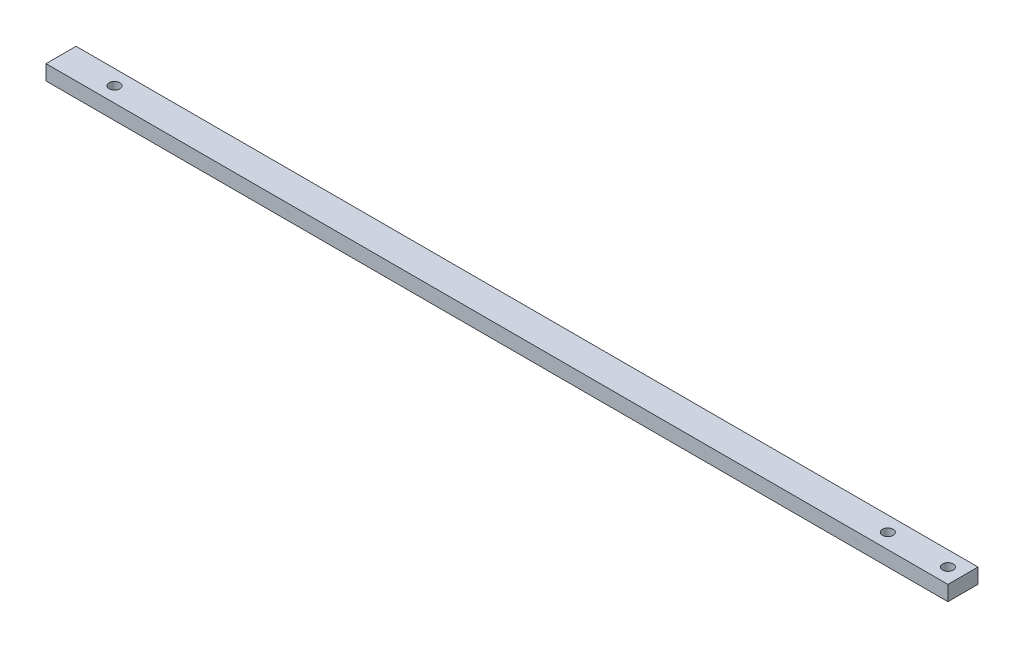
ISO-10303-21;
HEADER;
FILE_DESCRIPTION(('STEP AP214'),'2;1');
FILE_NAME('part.step','',(''),(''),'','','');
FILE_SCHEMA(('AUTOMOTIVE_DESIGN { 1 0 10303 214 1 1 1 1 }'));
ENDSEC;
DATA;
#1=APPLICATION_CONTEXT('core data for automotive mechanical design processes');
#2=APPLICATION_PROTOCOL_DEFINITION('international standard','automotive_design',2000,#1);
#3=PRODUCT_CONTEXT('',#1,'mechanical');
#4=PRODUCT('Part','Part','',(#3));
#5=PRODUCT_RELATED_PRODUCT_CATEGORY('part','',(#4));
#6=PRODUCT_DEFINITION_FORMATION('','',#4);
#7=PRODUCT_DEFINITION_CONTEXT('part definition',#1,'design');
#8=PRODUCT_DEFINITION('design','',#6,#7);
#9=PRODUCT_DEFINITION_SHAPE('','',#8);
#10=(LENGTH_UNIT() NAMED_UNIT(*) SI_UNIT(.MILLI.,.METRE.));
#11=(NAMED_UNIT(*) PLANE_ANGLE_UNIT() SI_UNIT($,.RADIAN.));
#12=(NAMED_UNIT(*) SI_UNIT($,.STERADIAN.) SOLID_ANGLE_UNIT());
#13=UNCERTAINTY_MEASURE_WITH_UNIT(LENGTH_MEASURE(1.E-05),#10,'distance_accuracy_value','');
#14=(GEOMETRIC_REPRESENTATION_CONTEXT(3) GLOBAL_UNCERTAINTY_ASSIGNED_CONTEXT((#13)) GLOBAL_UNIT_ASSIGNED_CONTEXT((#10,
#11,#12)) REPRESENTATION_CONTEXT('',''));
#15=CARTESIAN_POINT('',(0.,0.,0.));
#16=DIRECTION('',(0.,0.,1.));
#17=DIRECTION('',(1.,0.,0.));
#18=AXIS2_PLACEMENT_3D('',#15,#16,#17);
#19=CARTESIAN_POINT('',(0.,6.35,-12.7));
#20=DIRECTION('',(0.,0.,-1.));
#21=DIRECTION('',(-1.,0.,0.));
#22=AXIS2_PLACEMENT_3D('',#19,#20,#21);
#23=PLANE('',#22);
#24=DIRECTION('',(1.,0.,0.));
#25=VECTOR('',#24,1.);
#26=CARTESIAN_POINT('',(0.,0.,-12.7));
#27=LINE('',#26,#25);
#28=CARTESIAN_POINT('',(0.,0.,-12.7));
#29=VERTEX_POINT('',#28);
#30=CARTESIAN_POINT('',(381.,0.,-12.7));
#31=VERTEX_POINT('',#30);
#32=EDGE_CURVE('E114',#29,#31,#27,.T.);
#33=ORIENTED_EDGE('',*,*,#32,.F.);
#34=DIRECTION('',(0.,-1.,0.));
#35=VECTOR('',#34,1.);
#36=CARTESIAN_POINT('',(0.,6.35,-12.7));
#37=LINE('',#36,#35);
#38=CARTESIAN_POINT('',(0.,6.35,-12.7));
#39=VERTEX_POINT('',#38);
#40=EDGE_CURVE('E11',#39,#29,#37,.T.);
#41=ORIENTED_EDGE('',*,*,#40,.F.);
#42=DIRECTION('',(1.,0.,0.));
#43=VECTOR('',#42,1.);
#44=CARTESIAN_POINT('',(0.,6.35,-12.7));
#45=LINE('',#44,#43);
#46=CARTESIAN_POINT('',(381.,6.35,-12.7));
#47=VERTEX_POINT('',#46);
#48=EDGE_CURVE('E98',#39,#47,#45,.T.);
#49=ORIENTED_EDGE('',*,*,#48,.T.);
#50=DIRECTION('',(0.,-1.,0.));
#51=VECTOR('',#50,1.);
#52=CARTESIAN_POINT('',(381.,6.35,-12.7));
#53=LINE('',#52,#51);
#54=EDGE_CURVE('E77',#47,#31,#53,.T.);
#55=ORIENTED_EDGE('',*,*,#54,.T.);
#56=EDGE_LOOP('',(#33,#41,#49,#55));
#57=FACE_BOUND('',#56,.T.);
#58=ADVANCED_FACE('F37',(#57),#23,.T.);
#59=CARTESIAN_POINT('',(0.,6.35,0.));
#60=DIRECTION('',(-1.,0.,0.));
#61=DIRECTION('',(0.,0.,1.));
#62=AXIS2_PLACEMENT_3D('',#59,#60,#61);
#63=PLANE('',#62);
#64=DIRECTION('',(0.,0.,-1.));
#65=VECTOR('',#64,1.);
#66=CARTESIAN_POINT('',(0.,0.,0.));
#67=LINE('',#66,#65);
#68=CARTESIAN_POINT('',(0.,0.,0.));
#69=VERTEX_POINT('',#68);
#70=EDGE_CURVE('E89',#69,#29,#67,.T.);
#71=ORIENTED_EDGE('',*,*,#70,.F.);
#72=DIRECTION('',(0.,-1.,0.));
#73=VECTOR('',#72,1.);
#74=CARTESIAN_POINT('',(0.,6.35,0.));
#75=LINE('',#74,#73);
#76=CARTESIAN_POINT('',(0.,6.35,0.));
#77=VERTEX_POINT('',#76);
#78=EDGE_CURVE('E46',#77,#69,#75,.T.);
#79=ORIENTED_EDGE('',*,*,#78,.F.);
#80=DIRECTION('',(0.,0.,-1.));
#81=VECTOR('',#80,1.);
#82=CARTESIAN_POINT('',(0.,6.35,0.));
#83=LINE('',#82,#81);
#84=EDGE_CURVE('E87',#77,#39,#83,.T.);
#85=ORIENTED_EDGE('',*,*,#84,.T.);
#86=ORIENTED_EDGE('',*,*,#40,.T.);
#87=EDGE_LOOP('',(#71,#79,#85,#86));
#88=FACE_BOUND('',#87,.T.);
#89=ADVANCED_FACE('F85',(#88),#63,.T.);
#90=CARTESIAN_POINT('',(0.,6.35,0.));
#91=DIRECTION('',(0.,0.,-1.));
#92=DIRECTION('',(-1.,0.,0.));
#93=AXIS2_PLACEMENT_3D('',#90,#91,#92);
#94=PLANE('',#93);
#95=DIRECTION('',(1.,0.,0.));
#96=VECTOR('',#95,1.);
#97=CARTESIAN_POINT('',(0.,0.,0.));
#98=LINE('',#97,#96);
#99=CARTESIAN_POINT('',(381.,0.,0.));
#100=VERTEX_POINT('',#99);
#101=EDGE_CURVE('E117',#69,#100,#98,.T.);
#102=ORIENTED_EDGE('',*,*,#101,.T.);
#103=DIRECTION('',(0.,-1.,0.));
#104=VECTOR('',#103,1.);
#105=CARTESIAN_POINT('',(381.,6.35,0.));
#106=LINE('',#105,#104);
#107=CARTESIAN_POINT('',(381.,6.35,0.));
#108=VERTEX_POINT('',#107);
#109=EDGE_CURVE('E92',#108,#100,#106,.T.);
#110=ORIENTED_EDGE('',*,*,#109,.F.);
#111=DIRECTION('',(1.,0.,0.));
#112=VECTOR('',#111,1.);
#113=CARTESIAN_POINT('',(0.,6.35,0.));
#114=LINE('',#113,#112);
#115=EDGE_CURVE('E94',#77,#108,#114,.T.);
#116=ORIENTED_EDGE('',*,*,#115,.F.);
#117=ORIENTED_EDGE('',*,*,#78,.T.);
#118=EDGE_LOOP('',(#102,#110,#116,#117));
#119=FACE_BOUND('',#118,.T.);
#120=ADVANCED_FACE('F95',(#119),#94,.F.);
#121=CARTESIAN_POINT('',(349.25,6.35,-6.35));
#122=DIRECTION('',(0.,-1.,0.));
#123=DIRECTION('',(0.,0.,-1.));
#124=AXIS2_PLACEMENT_3D('',#121,#122,#123);
#125=CYLINDRICAL_SURFACE('',#124,2.24790000000001);
#126=CARTESIAN_POINT('',(349.25,6.35,-6.35));
#127=DIRECTION('',(0.,1.,0.));
#128=DIRECTION('',(0.,0.,1.));
#129=AXIS2_PLACEMENT_3D('',#126,#127,#128);
#130=CIRCLE('',#129,2.24790000000001);
#131=CARTESIAN_POINT('',(349.25,6.35,-4.10209999999999));
#132=VERTEX_POINT('',#131);
#133=EDGE_CURVE('E100',#132,#132,#130,.T.);
#134=ORIENTED_EDGE('',*,*,#133,.T.);
#135=EDGE_LOOP('',(#134));
#136=FACE_BOUND('',#135,.T.);
#137=CARTESIAN_POINT('',(349.25,0.,-6.35));
#138=DIRECTION('',(0.,1.,0.));
#139=DIRECTION('',(0.,0.,1.));
#140=AXIS2_PLACEMENT_3D('',#137,#138,#139);
#141=CIRCLE('',#140,2.24790000000001);
#142=CARTESIAN_POINT('',(349.25,0.,-4.10209999999999));
#143=VERTEX_POINT('',#142);
#144=EDGE_CURVE('E111',#143,#143,#141,.T.);
#145=ORIENTED_EDGE('',*,*,#144,.F.);
#146=EDGE_LOOP('',(#145));
#147=FACE_BOUND('',#146,.T.);
#148=ADVANCED_FACE('F133',(#136,#147),#125,.F.);
#149=CARTESIAN_POINT('',(374.65,6.35,-6.35));
#150=DIRECTION('',(0.,-1.,0.));
#151=DIRECTION('',(0.,0.,-1.));
#152=AXIS2_PLACEMENT_3D('',#149,#150,#151);
#153=CYLINDRICAL_SURFACE('',#152,2.24790000000001);
#154=CARTESIAN_POINT('',(374.65,6.35,-6.35));
#155=DIRECTION('',(0.,1.,0.));
#156=DIRECTION('',(0.,0.,1.));
#157=AXIS2_PLACEMENT_3D('',#154,#155,#156);
#158=CIRCLE('',#157,2.24790000000001);
#159=CARTESIAN_POINT('',(374.65,6.35,-4.10209999999999));
#160=VERTEX_POINT('',#159);
#161=EDGE_CURVE('E146',#160,#160,#158,.T.);
#162=ORIENTED_EDGE('',*,*,#161,.T.);
#163=EDGE_LOOP('',(#162));
#164=FACE_BOUND('',#163,.T.);
#165=CARTESIAN_POINT('',(374.65,0.,-6.35));
#166=DIRECTION('',(0.,1.,0.));
#167=DIRECTION('',(0.,0.,1.));
#168=AXIS2_PLACEMENT_3D('',#165,#166,#167);
#169=CIRCLE('',#168,2.24790000000001);
#170=CARTESIAN_POINT('',(374.65,0.,-4.10209999999999));
#171=VERTEX_POINT('',#170);
#172=EDGE_CURVE('E108',#171,#171,#169,.T.);
#173=ORIENTED_EDGE('',*,*,#172,.F.);
#174=EDGE_LOOP('',(#173));
#175=FACE_BOUND('',#174,.T.);
#176=ADVANCED_FACE('F135',(#164,#175),#153,.F.);
#177=CARTESIAN_POINT('',(22.5679,6.35,-6.35));
#178=DIRECTION('',(0.,-1.,0.));
#179=DIRECTION('',(0.,0.,-1.));
#180=AXIS2_PLACEMENT_3D('',#177,#178,#179);
#181=CYLINDRICAL_SURFACE('',#180,2.2479);
#182=CARTESIAN_POINT('',(22.5679,6.35,-6.35));
#183=DIRECTION('',(0.,1.,0.));
#184=DIRECTION('',(0.,0.,1.));
#185=AXIS2_PLACEMENT_3D('',#182,#183,#184);
#186=CIRCLE('',#185,2.2479);
#187=CARTESIAN_POINT('',(22.5679,6.35,-4.1021));
#188=VERTEX_POINT('',#187);
#189=EDGE_CURVE('E120',#188,#188,#186,.T.);
#190=ORIENTED_EDGE('',*,*,#189,.T.);
#191=EDGE_LOOP('',(#190));
#192=FACE_BOUND('',#191,.T.);
#193=CARTESIAN_POINT('',(22.5679,0.,-6.35));
#194=DIRECTION('',(0.,1.,0.));
#195=DIRECTION('',(0.,0.,1.));
#196=AXIS2_PLACEMENT_3D('',#193,#194,#195);
#197=CIRCLE('',#196,2.2479);
#198=CARTESIAN_POINT('',(22.5679,0.,-4.1021));
#199=VERTEX_POINT('',#198);
#200=EDGE_CURVE('E105',#199,#199,#197,.T.);
#201=ORIENTED_EDGE('',*,*,#200,.F.);
#202=EDGE_LOOP('',(#201));
#203=FACE_BOUND('',#202,.T.);
#204=ADVANCED_FACE('F39',(#192,#203),#181,.F.);
#205=CARTESIAN_POINT('',(381.,6.35,0.));
#206=DIRECTION('',(-1.,0.,0.));
#207=DIRECTION('',(0.,0.,1.));
#208=AXIS2_PLACEMENT_3D('',#205,#206,#207);
#209=PLANE('',#208);
#210=DIRECTION('',(0.,0.,-1.));
#211=VECTOR('',#210,1.);
#212=CARTESIAN_POINT('',(381.,0.,0.));
#213=LINE('',#212,#211);
#214=EDGE_CURVE('E70',#100,#31,#213,.T.);
#215=ORIENTED_EDGE('',*,*,#214,.T.);
#216=ORIENTED_EDGE('',*,*,#54,.F.);
#217=DIRECTION('',(0.,0.,-1.));
#218=VECTOR('',#217,1.);
#219=CARTESIAN_POINT('',(381.,6.35,0.));
#220=LINE('',#219,#218);
#221=EDGE_CURVE('E54',#108,#47,#220,.T.);
#222=ORIENTED_EDGE('',*,*,#221,.F.);
#223=ORIENTED_EDGE('',*,*,#109,.T.);
#224=EDGE_LOOP('',(#215,#216,#222,#223));
#225=FACE_BOUND('',#224,.T.);
#226=ADVANCED_FACE('F123',(#225),#209,.F.);
#227=CARTESIAN_POINT('',(0.,6.35,0.));
#228=DIRECTION('',(0.,1.,0.));
#229=DIRECTION('',(0.,0.,1.));
#230=AXIS2_PLACEMENT_3D('',#227,#228,#229);
#231=PLANE('',#230);
#232=ORIENTED_EDGE('',*,*,#189,.F.);
#233=EDGE_LOOP('',(#232));
#234=FACE_BOUND('',#233,.T.);
#235=ORIENTED_EDGE('',*,*,#161,.F.);
#236=EDGE_LOOP('',(#235));
#237=FACE_BOUND('',#236,.T.);
#238=ORIENTED_EDGE('',*,*,#133,.F.);
#239=EDGE_LOOP('',(#238));
#240=FACE_BOUND('',#239,.T.);
#241=ORIENTED_EDGE('',*,*,#48,.F.);
#242=ORIENTED_EDGE('',*,*,#84,.F.);
#243=ORIENTED_EDGE('',*,*,#115,.T.);
#244=ORIENTED_EDGE('',*,*,#221,.T.);
#245=EDGE_LOOP('',(#241,#242,#243,#244));
#246=FACE_BOUND('',#245,.T.);
#247=ADVANCED_FACE('F97',(#234,#237,#240,#246),#231,.T.);
#248=CARTESIAN_POINT('',(0.,0.,0.));
#249=DIRECTION('',(0.,1.,0.));
#250=DIRECTION('',(0.,0.,1.));
#251=AXIS2_PLACEMENT_3D('',#248,#249,#250);
#252=PLANE('',#251);
#253=ORIENTED_EDGE('',*,*,#200,.T.);
#254=EDGE_LOOP('',(#253));
#255=FACE_BOUND('',#254,.T.);
#256=ORIENTED_EDGE('',*,*,#172,.T.);
#257=EDGE_LOOP('',(#256));
#258=FACE_BOUND('',#257,.T.);
#259=ORIENTED_EDGE('',*,*,#144,.T.);
#260=EDGE_LOOP('',(#259));
#261=FACE_BOUND('',#260,.T.);
#262=ORIENTED_EDGE('',*,*,#32,.T.);
#263=ORIENTED_EDGE('',*,*,#214,.F.);
#264=ORIENTED_EDGE('',*,*,#101,.F.);
#265=ORIENTED_EDGE('',*,*,#70,.T.);
#266=EDGE_LOOP('',(#262,#263,#264,#265));
#267=FACE_BOUND('',#266,.T.);
#268=ADVANCED_FACE('F124',(#255,#258,#261,#267),#252,.F.);
#269=CLOSED_SHELL('',(#58,#89,#120,#148,#176,#204,#226,#247,#268));
#270=MANIFOLD_SOLID_BREP('B2',#269);
#271=ADVANCED_BREP_SHAPE_REPRESENTATION('',(#18,#270),#14);
#272=SHAPE_DEFINITION_REPRESENTATION(#9,#271);
ENDSEC;
END-ISO-10303-21;
